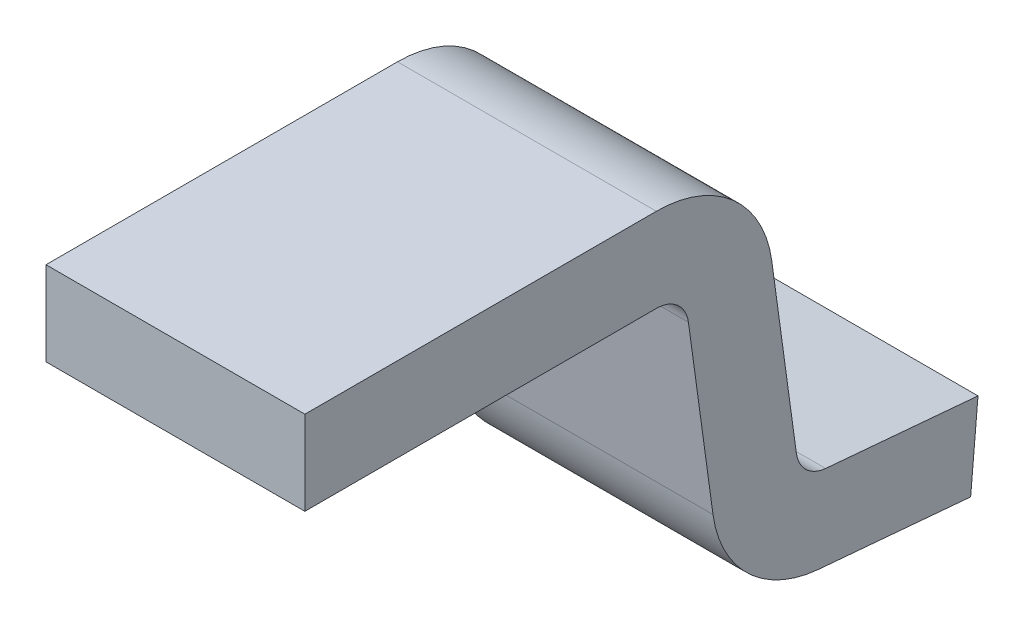
ISO-10303-21;
HEADER;
FILE_DESCRIPTION(('STEP AP214'),'2;1');
FILE_NAME('part.step','',(''),(''),'','','');
FILE_SCHEMA(('AUTOMOTIVE_DESIGN { 1 0 10303 214 1 1 1 1 }'));
ENDSEC;
DATA;
#1=APPLICATION_CONTEXT('core data for automotive mechanical design processes');
#2=APPLICATION_PROTOCOL_DEFINITION('international standard','automotive_design',2000,#1);
#3=PRODUCT_CONTEXT('',#1,'mechanical');
#4=PRODUCT('Part','Part','',(#3));
#5=PRODUCT_RELATED_PRODUCT_CATEGORY('part','',(#4));
#6=PRODUCT_DEFINITION_FORMATION('','',#4);
#7=PRODUCT_DEFINITION_CONTEXT('part definition',#1,'design');
#8=PRODUCT_DEFINITION('design','',#6,#7);
#9=PRODUCT_DEFINITION_SHAPE('','',#8);
#10=(LENGTH_UNIT() NAMED_UNIT(*) SI_UNIT(.MILLI.,.METRE.));
#11=(NAMED_UNIT(*) PLANE_ANGLE_UNIT() SI_UNIT($,.RADIAN.));
#12=(NAMED_UNIT(*) SI_UNIT($,.STERADIAN.) SOLID_ANGLE_UNIT());
#13=UNCERTAINTY_MEASURE_WITH_UNIT(LENGTH_MEASURE(1.E-05),#10,'distance_accuracy_value','');
#14=(GEOMETRIC_REPRESENTATION_CONTEXT(3) GLOBAL_UNCERTAINTY_ASSIGNED_CONTEXT((#13)) GLOBAL_UNIT_ASSIGNED_CONTEXT((#10,
#11,#12)) REPRESENTATION_CONTEXT('',''));
#15=CARTESIAN_POINT('',(0.,0.,0.));
#16=DIRECTION('',(0.,0.,1.));
#17=DIRECTION('',(1.,0.,0.));
#18=AXIS2_PLACEMENT_3D('',#15,#16,#17);
#19=CARTESIAN_POINT('',(-4.626,3.4206,-4.3760443022156));
#20=DIRECTION('',(-1.,0.,0.));
#21=DIRECTION('',(0.,0.,1.));
#22=AXIS2_PLACEMENT_3D('',#19,#20,#21);
#23=CYLINDRICAL_SURFACE('',#22,0.18);
#24=CARTESIAN_POINT('',(-5.026,3.4206,-4.3760443022156));
#25=DIRECTION('',(1.,0.,0.));
#26=DIRECTION('',(0.,0.,-1.));
#27=AXIS2_PLACEMENT_3D('',#24,#25,#26);
#28=CIRCLE('',#27,0.18);
#29=CARTESIAN_POINT('',(-5.026,3.4451056785533,-4.5543683659834));
#30=VERTEX_POINT('',#29);
#31=CARTESIAN_POINT('',(-5.026,3.6006,-4.3760443022156));
#32=VERTEX_POINT('',#31);
#33=EDGE_CURVE('E11',#30,#32,#28,.T.);
#34=ORIENTED_EDGE('',*,*,#33,.T.);
#35=DIRECTION('',(-1.,0.,0.));
#36=VECTOR('',#35,1.);
#37=CARTESIAN_POINT('',(-4.626,3.6006,-4.3760443022156));
#38=LINE('',#37,#36);
#39=CARTESIAN_POINT('',(-4.626,3.6006,-4.3760443022156));
#40=VERTEX_POINT('',#39);
#41=EDGE_CURVE('E24',#40,#32,#38,.T.);
#42=ORIENTED_EDGE('',*,*,#41,.F.);
#43=CARTESIAN_POINT('',(-4.626,3.4206,-4.3760443022156));
#44=DIRECTION('',(1.,0.,0.));
#45=DIRECTION('',(0.,0.,-1.));
#46=AXIS2_PLACEMENT_3D('',#43,#44,#45);
#47=CIRCLE('',#46,0.18);
#48=CARTESIAN_POINT('',(-4.626,3.4451056785533,-4.5543683659834));
#49=VERTEX_POINT('',#48);
#50=EDGE_CURVE('E199',#49,#40,#47,.T.);
#51=ORIENTED_EDGE('',*,*,#50,.F.);
#52=DIRECTION('',(-1.,0.,0.));
#53=VECTOR('',#52,1.);
#54=CARTESIAN_POINT('',(-4.626,3.4451056785533,-4.5543683659834));
#55=LINE('',#54,#53);
#56=EDGE_CURVE('E126',#49,#30,#55,.T.);
#57=ORIENTED_EDGE('',*,*,#56,.T.);
#58=EDGE_LOOP('',(#34,#42,#51,#57));
#59=FACE_BOUND('',#58,.T.);
#60=ADVANCED_FACE('F17',(#59),#23,.T.);
#61=CARTESIAN_POINT('',(-4.626,3.6006,-4.3760443022156));
#62=DIRECTION('',(0.,-1.,0.));
#63=DIRECTION('',(0.,0.,-1.));
#64=AXIS2_PLACEMENT_3D('',#61,#62,#63);
#65=PLANE('',#64);
#66=DIRECTION('',(0.,0.,1.));
#67=VECTOR('',#66,1.);
#68=CARTESIAN_POINT('',(-5.026,3.6006,-4.3760443022156));
#69=LINE('',#68,#67);
#70=CARTESIAN_POINT('',(-5.026,3.6006,-3.833));
#71=VERTEX_POINT('',#70);
#72=EDGE_CURVE('E196',#32,#71,#69,.T.);
#73=ORIENTED_EDGE('',*,*,#72,.T.);
#74=DIRECTION('',(-1.,0.,0.));
#75=VECTOR('',#74,1.);
#76=CARTESIAN_POINT('',(-4.626,3.6006,-3.833));
#77=LINE('',#76,#75);
#78=CARTESIAN_POINT('',(-4.626,3.6006,-3.833));
#79=VERTEX_POINT('',#78);
#80=EDGE_CURVE('E193',#79,#71,#77,.T.);
#81=ORIENTED_EDGE('',*,*,#80,.F.);
#82=DIRECTION('',(0.,0.,1.));
#83=VECTOR('',#82,1.);
#84=CARTESIAN_POINT('',(-4.626,3.6006,-4.3760443022156));
#85=LINE('',#84,#83);
#86=EDGE_CURVE('E190',#40,#79,#85,.T.);
#87=ORIENTED_EDGE('',*,*,#86,.F.);
#88=ORIENTED_EDGE('',*,*,#41,.T.);
#89=EDGE_LOOP('',(#73,#81,#87,#88));
#90=FACE_BOUND('',#89,.T.);
#91=ADVANCED_FACE('F202',(#90),#65,.F.);
#92=CARTESIAN_POINT('',(-4.626,3.6006,-3.833));
#93=DIRECTION('',(0.,0.,-1.));
#94=DIRECTION('',(0.,1.,0.));
#95=AXIS2_PLACEMENT_3D('',#92,#93,#94);
#96=PLANE('',#95);
#97=DIRECTION('',(0.,-1.,0.));
#98=VECTOR('',#97,1.);
#99=CARTESIAN_POINT('',(-5.026,3.6006,-3.833));
#100=LINE('',#99,#98);
#101=CARTESIAN_POINT('',(-5.026,3.4706,-3.833));
#102=VERTEX_POINT('',#101);
#103=EDGE_CURVE('E188',#71,#102,#100,.T.);
#104=ORIENTED_EDGE('',*,*,#103,.T.);
#105=DIRECTION('',(-1.,0.,0.));
#106=VECTOR('',#105,1.);
#107=CARTESIAN_POINT('',(-4.626,3.4706,-3.833));
#108=LINE('',#107,#106);
#109=CARTESIAN_POINT('',(-4.626,3.4706,-3.833));
#110=VERTEX_POINT('',#109);
#111=EDGE_CURVE('E185',#110,#102,#108,.T.);
#112=ORIENTED_EDGE('',*,*,#111,.F.);
#113=DIRECTION('',(0.,-1.,0.));
#114=VECTOR('',#113,1.);
#115=CARTESIAN_POINT('',(-4.626,3.6006,-3.833));
#116=LINE('',#115,#114);
#117=EDGE_CURVE('E182',#79,#110,#116,.T.);
#118=ORIENTED_EDGE('',*,*,#117,.F.);
#119=ORIENTED_EDGE('',*,*,#80,.T.);
#120=EDGE_LOOP('',(#104,#112,#118,#119));
#121=FACE_BOUND('',#120,.T.);
#122=ADVANCED_FACE('F208',(#121),#96,.F.);
#123=CARTESIAN_POINT('',(-4.626,3.4706,-3.833));
#124=DIRECTION('',(0.,1.,0.));
#125=DIRECTION('',(0.,0.,1.));
#126=AXIS2_PLACEMENT_3D('',#123,#124,#125);
#127=PLANE('',#126);
#128=DIRECTION('',(0.,0.,-1.));
#129=VECTOR('',#128,1.);
#130=CARTESIAN_POINT('',(-5.026,3.4706,-3.833));
#131=LINE('',#130,#129);
#132=CARTESIAN_POINT('',(-5.026,3.4706,-4.3760443022156));
#133=VERTEX_POINT('',#132);
#134=EDGE_CURVE('E180',#102,#133,#131,.T.);
#135=ORIENTED_EDGE('',*,*,#134,.T.);
#136=DIRECTION('',(-1.,0.,0.));
#137=VECTOR('',#136,1.);
#138=CARTESIAN_POINT('',(-4.626,3.4706,-4.3760443022156));
#139=LINE('',#138,#137);
#140=CARTESIAN_POINT('',(-4.626,3.4706,-4.3760443022156));
#141=VERTEX_POINT('',#140);
#142=EDGE_CURVE('E177',#141,#133,#139,.T.);
#143=ORIENTED_EDGE('',*,*,#142,.F.);
#144=DIRECTION('',(0.,0.,-1.));
#145=VECTOR('',#144,1.);
#146=CARTESIAN_POINT('',(-4.626,3.4706,-3.833));
#147=LINE('',#146,#145);
#148=EDGE_CURVE('E174',#110,#141,#147,.T.);
#149=ORIENTED_EDGE('',*,*,#148,.F.);
#150=ORIENTED_EDGE('',*,*,#111,.T.);
#151=EDGE_LOOP('',(#135,#143,#149,#150));
#152=FACE_BOUND('',#151,.T.);
#153=ADVANCED_FACE('F212',(#152),#127,.F.);
#154=CARTESIAN_POINT('',(-4.626,3.4206,-4.3760443022156));
#155=DIRECTION('',(-1.,0.,0.));
#156=DIRECTION('',(0.,0.,1.));
#157=AXIS2_PLACEMENT_3D('',#154,#155,#156);
#158=CYLINDRICAL_SURFACE('',#157,0.0499999999999997);
#159=CARTESIAN_POINT('',(-5.026,3.4206,-4.3760443022156));
#160=DIRECTION('',(-1.,0.,0.));
#161=DIRECTION('',(0.,0.,1.));
#162=AXIS2_PLACEMENT_3D('',#159,#160,#161);
#163=CIRCLE('',#162,0.0499999999999997);
#164=CARTESIAN_POINT('',(-5.026,3.4274071329314,-4.4255787643733));
#165=VERTEX_POINT('',#164);
#166=EDGE_CURVE('E171',#133,#165,#163,.T.);
#167=ORIENTED_EDGE('',*,*,#166,.T.);
#168=DIRECTION('',(-1.,0.,0.));
#169=VECTOR('',#168,1.);
#170=CARTESIAN_POINT('',(-4.626,3.4274071329314,-4.4255787643733));
#171=LINE('',#170,#169);
#172=CARTESIAN_POINT('',(-4.626,3.4274071329314,-4.4255787643733));
#173=VERTEX_POINT('',#172);
#174=EDGE_CURVE('E169',#173,#165,#171,.T.);
#175=ORIENTED_EDGE('',*,*,#174,.F.);
#176=CARTESIAN_POINT('',(-4.626,3.4206,-4.3760443022156));
#177=DIRECTION('',(-1.,0.,0.));
#178=DIRECTION('',(0.,0.,1.));
#179=AXIS2_PLACEMENT_3D('',#176,#177,#178);
#180=CIRCLE('',#179,0.0499999999999997);
#181=EDGE_CURVE('E167',#141,#173,#180,.T.);
#182=ORIENTED_EDGE('',*,*,#181,.F.);
#183=ORIENTED_EDGE('',*,*,#142,.T.);
#184=EDGE_LOOP('',(#167,#175,#182,#183));
#185=FACE_BOUND('',#184,.T.);
#186=ADVANCED_FACE('F216',(#185),#158,.F.);
#187=CARTESIAN_POINT('',(-4.626,3.4274071329314,-4.4255787643733));
#188=DIRECTION('',(0.,0.136142658629304,-0.990689243154151));
#189=DIRECTION('',(0.,0.990689243154151,0.136142658629304));
#190=AXIS2_PLACEMENT_3D('',#187,#188,#189);
#191=PLANE('',#190);
#192=DIRECTION('',(0.,-0.990689243154151,-0.136142658629304));
#193=VECTOR('',#192,1.);
#194=CARTESIAN_POINT('',(-5.026,3.4274071329314,-4.4255787643733));
#195=LINE('',#194,#193);
#196=CARTESIAN_POINT('',(-5.026,3.151010491973,-4.4635617886126));
#197=VERTEX_POINT('',#196);
#198=EDGE_CURVE('E165',#165,#197,#195,.T.);
#199=ORIENTED_EDGE('',*,*,#198,.T.);
#200=DIRECTION('',(-1.,0.,0.));
#201=VECTOR('',#200,1.);
#202=CARTESIAN_POINT('',(-4.626,3.151010491973,-4.4635617886126));
#203=LINE('',#202,#201);
#204=CARTESIAN_POINT('',(-4.626,3.151010491973,-4.4635617886126));
#205=VERTEX_POINT('',#204);
#206=EDGE_CURVE('E162',#205,#197,#203,.T.);
#207=ORIENTED_EDGE('',*,*,#206,.F.);
#208=DIRECTION('',(0.,-0.990689243154151,-0.136142658629304));
#209=VECTOR('',#208,1.);
#210=CARTESIAN_POINT('',(-4.626,3.4274071329314,-4.4255787643733));
#211=LINE('',#210,#209);
#212=EDGE_CURVE('E159',#173,#205,#211,.T.);
#213=ORIENTED_EDGE('',*,*,#212,.F.);
#214=ORIENTED_EDGE('',*,*,#174,.T.);
#215=EDGE_LOOP('',(#199,#207,#213,#214));
#216=FACE_BOUND('',#215,.T.);
#217=ADVANCED_FACE('F220',(#216),#191,.F.);
#218=CARTESIAN_POINT('',(-4.626,3.1755161705263,-4.6418858523803));
#219=DIRECTION('',(-1.,0.,0.));
#220=DIRECTION('',(0.,0.,1.));
#221=AXIS2_PLACEMENT_3D('',#218,#219,#220);
#222=CYLINDRICAL_SURFACE('',#221,0.18);
#223=CARTESIAN_POINT('',(-5.026,3.1755161705263,-4.6418858523803));
#224=DIRECTION('',(1.,0.,0.));
#225=DIRECTION('',(0.,0.,1.));
#226=AXIS2_PLACEMENT_3D('',#223,#224,#225);
#227=CIRCLE('',#226,0.18);
#228=CARTESIAN_POINT('',(-5.026,2.9962011248698,-4.6261978186858));
#229=VERTEX_POINT('',#228);
#230=EDGE_CURVE('E157',#197,#229,#227,.T.);
#231=ORIENTED_EDGE('',*,*,#230,.T.);
#232=DIRECTION('',(-1.,0.,0.));
#233=VECTOR('',#232,1.);
#234=CARTESIAN_POINT('',(-4.626,2.9962011248698,-4.6261978186858));
#235=LINE('',#234,#233);
#236=CARTESIAN_POINT('',(-4.626,2.9962011248698,-4.6261978186858));
#237=VERTEX_POINT('',#236);
#238=EDGE_CURVE('E154',#237,#229,#235,.T.);
#239=ORIENTED_EDGE('',*,*,#238,.F.);
#240=CARTESIAN_POINT('',(-4.626,3.1755161705263,-4.6418858523803));
#241=DIRECTION('',(1.,0.,0.));
#242=DIRECTION('',(0.,0.,1.));
#243=AXIS2_PLACEMENT_3D('',#240,#241,#242);
#244=CIRCLE('',#243,0.18);
#245=EDGE_CURVE('E151',#205,#237,#244,.T.);
#246=ORIENTED_EDGE('',*,*,#245,.F.);
#247=ORIENTED_EDGE('',*,*,#206,.T.);
#248=EDGE_LOOP('',(#231,#239,#246,#247));
#249=FACE_BOUND('',#248,.T.);
#250=ADVANCED_FACE('F224',(#249),#222,.T.);
#251=CARTESIAN_POINT('',(-4.626,2.9756,-4.8616697534428));
#252=DIRECTION('',(0.,0.996194698091746,-0.087155742747652));
#253=DIRECTION('',(0.,0.087155742747652,0.996194698091746));
#254=AXIS2_PLACEMENT_3D('',#251,#252,#253);
#255=PLANE('',#254);
#256=DIRECTION('',(0.,-0.087155742747652,-0.996194698091746));
#257=VECTOR('',#256,1.);
#258=CARTESIAN_POINT('',(-5.026,2.9756,-4.8616697534428));
#259=LINE('',#258,#257);
#260=CARTESIAN_POINT('',(-5.026,2.9756,-4.8616697534428));
#261=VERTEX_POINT('',#260);
#262=EDGE_CURVE('E149',#229,#261,#259,.T.);
#263=ORIENTED_EDGE('',*,*,#262,.T.);
#264=DIRECTION('',(-1.,0.,0.));
#265=VECTOR('',#264,1.);
#266=CARTESIAN_POINT('',(-4.626,2.9756,-4.8616697534428));
#267=LINE('',#266,#265);
#268=CARTESIAN_POINT('',(-4.626,2.9756,-4.8616697534428));
#269=VERTEX_POINT('',#268);
#270=EDGE_CURVE('E146',#269,#261,#267,.T.);
#271=ORIENTED_EDGE('',*,*,#270,.F.);
#272=DIRECTION('',(0.,-0.087155742747652,-0.996194698091746));
#273=VECTOR('',#272,1.);
#274=CARTESIAN_POINT('',(-4.626,2.9756,-4.8616697534428));
#275=LINE('',#274,#273);
#276=EDGE_CURVE('E143',#237,#269,#275,.T.);
#277=ORIENTED_EDGE('',*,*,#276,.F.);
#278=ORIENTED_EDGE('',*,*,#238,.T.);
#279=EDGE_LOOP('',(#263,#271,#277,#278));
#280=FACE_BOUND('',#279,.T.);
#281=ADVANCED_FACE('F228',(#280),#255,.F.);
#282=CARTESIAN_POINT('',(-4.626,2.9756,-4.8616697534428));
#283=DIRECTION('',(0.,0.0871557427476519,0.996194698091746));
#284=DIRECTION('',(0.,-0.996194698091746,0.0871557427476519));
#285=AXIS2_PLACEMENT_3D('',#282,#283,#284);
#286=PLANE('',#285);
#287=DIRECTION('',(0.,0.996194698091746,-0.0871557427476519));
#288=VECTOR('',#287,1.);
#289=CARTESIAN_POINT('',(-5.026,2.9756,-4.8616697534428));
#290=LINE('',#289,#288);
#291=CARTESIAN_POINT('',(-5.026,3.1051053107519,-4.873));
#292=VERTEX_POINT('',#291);
#293=EDGE_CURVE('E141',#261,#292,#290,.T.);
#294=ORIENTED_EDGE('',*,*,#293,.T.);
#295=DIRECTION('',(-1.,0.,0.));
#296=VECTOR('',#295,1.);
#297=CARTESIAN_POINT('',(-4.626,3.1051053107519,-4.873));
#298=LINE('',#297,#296);
#299=CARTESIAN_POINT('',(-4.626,3.1051053107519,-4.873));
#300=VERTEX_POINT('',#299);
#301=EDGE_CURVE('E138',#300,#292,#298,.T.);
#302=ORIENTED_EDGE('',*,*,#301,.F.);
#303=DIRECTION('',(0.,0.996194698091746,-0.0871557427476519));
#304=VECTOR('',#303,1.);
#305=CARTESIAN_POINT('',(-4.626,2.9756,-4.8616697534428));
#306=LINE('',#305,#304);
#307=EDGE_CURVE('E136',#269,#300,#306,.T.);
#308=ORIENTED_EDGE('',*,*,#307,.F.);
#309=ORIENTED_EDGE('',*,*,#270,.T.);
#310=EDGE_LOOP('',(#294,#302,#308,#309));
#311=FACE_BOUND('',#310,.T.);
#312=ADVANCED_FACE('F232',(#311),#286,.F.);
#313=CARTESIAN_POINT('',(-4.626,3.1051053107519,-4.873));
#314=DIRECTION('',(0.,-0.996194698091746,0.0871557427476516));
#315=DIRECTION('',(0.,-0.0871557427476516,-0.996194698091746));
#316=AXIS2_PLACEMENT_3D('',#313,#314,#315);
#317=PLANE('',#316);
#318=DIRECTION('',(0.,0.0871557427476516,0.996194698091746));
#319=VECTOR('',#318,1.);
#320=CARTESIAN_POINT('',(-5.026,3.1051053107519,-4.873));
#321=LINE('',#320,#319);
#322=CARTESIAN_POINT('',(-5.026,3.1257064356217,-4.637528065243));
#323=VERTEX_POINT('',#322);
#324=EDGE_CURVE('E134',#292,#323,#321,.T.);
#325=ORIENTED_EDGE('',*,*,#324,.T.);
#326=DIRECTION('',(-1.,0.,0.));
#327=VECTOR('',#326,1.);
#328=CARTESIAN_POINT('',(-4.626,3.1257064356217,-4.637528065243));
#329=LINE('',#328,#327);
#330=CARTESIAN_POINT('',(-4.626,3.1257064356217,-4.637528065243));
#331=VERTEX_POINT('',#330);
#332=EDGE_CURVE('E132',#331,#323,#329,.T.);
#333=ORIENTED_EDGE('',*,*,#332,.F.);
#334=DIRECTION('',(0.,0.0871557427476516,0.996194698091746));
#335=VECTOR('',#334,1.);
#336=CARTESIAN_POINT('',(-4.626,3.1051053107519,-4.873));
#337=LINE('',#336,#335);
#338=EDGE_CURVE('E111',#300,#331,#337,.T.);
#339=ORIENTED_EDGE('',*,*,#338,.F.);
#340=ORIENTED_EDGE('',*,*,#301,.T.);
#341=EDGE_LOOP('',(#325,#333,#339,#340));
#342=FACE_BOUND('',#341,.T.);
#343=ADVANCED_FACE('F235',(#342),#317,.F.);
#344=CARTESIAN_POINT('',(-4.626,3.1755161705263,-4.6418858523803));
#345=DIRECTION('',(-1.,0.,0.));
#346=DIRECTION('',(0.,0.,1.));
#347=AXIS2_PLACEMENT_3D('',#344,#345,#346);
#348=CYLINDRICAL_SURFACE('',#347,0.0499999999999997);
#349=CARTESIAN_POINT('',(-5.026,3.1755161705263,-4.6418858523803));
#350=DIRECTION('',(-1.,0.,0.));
#351=DIRECTION('',(0.,0.,1.));
#352=AXIS2_PLACEMENT_3D('',#349,#350,#351);
#353=CIRCLE('',#352,0.0499999999999997);
#354=CARTESIAN_POINT('',(-5.026,3.1687090375948,-4.5923513902226));
#355=VERTEX_POINT('',#354);
#356=EDGE_CURVE('E120',#323,#355,#353,.T.);
#357=ORIENTED_EDGE('',*,*,#356,.T.);
#358=DIRECTION('',(-1.,0.,0.));
#359=VECTOR('',#358,1.);
#360=CARTESIAN_POINT('',(-4.626,3.1687090375948,-4.5923513902226));
#361=LINE('',#360,#359);
#362=CARTESIAN_POINT('',(-4.626,3.1687090375948,-4.5923513902226));
#363=VERTEX_POINT('',#362);
#364=EDGE_CURVE('E114',#363,#355,#361,.T.);
#365=ORIENTED_EDGE('',*,*,#364,.F.);
#366=CARTESIAN_POINT('',(-4.626,3.1755161705263,-4.6418858523803));
#367=DIRECTION('',(-1.,0.,0.));
#368=DIRECTION('',(0.,0.,1.));
#369=AXIS2_PLACEMENT_3D('',#366,#367,#368);
#370=CIRCLE('',#369,0.0499999999999997);
#371=EDGE_CURVE('E103',#331,#363,#370,.T.);
#372=ORIENTED_EDGE('',*,*,#371,.F.);
#373=ORIENTED_EDGE('',*,*,#332,.T.);
#374=EDGE_LOOP('',(#357,#365,#372,#373));
#375=FACE_BOUND('',#374,.T.);
#376=ADVANCED_FACE('F118',(#375),#348,.F.);
#377=CARTESIAN_POINT('',(-4.626,3.1687090375948,-4.5923513902226));
#378=DIRECTION('',(0.,-0.136142658629305,0.990689243154151));
#379=DIRECTION('',(0.,-0.990689243154151,-0.136142658629305));
#380=AXIS2_PLACEMENT_3D('',#377,#378,#379);
#381=PLANE('',#380);
#382=DIRECTION('',(0.,0.990689243154151,0.136142658629305));
#383=VECTOR('',#382,1.);
#384=CARTESIAN_POINT('',(-5.026,3.1687090375948,-4.5923513902226));
#385=LINE('',#384,#383);
#386=EDGE_CURVE('E115',#355,#30,#385,.T.);
#387=ORIENTED_EDGE('',*,*,#386,.T.);
#388=ORIENTED_EDGE('',*,*,#56,.F.);
#389=DIRECTION('',(0.,0.990689243154151,0.136142658629305));
#390=VECTOR('',#389,1.);
#391=CARTESIAN_POINT('',(-4.626,3.1687090375948,-4.5923513902226));
#392=LINE('',#391,#390);
#393=EDGE_CURVE('E108',#363,#49,#392,.T.);
#394=ORIENTED_EDGE('',*,*,#393,.F.);
#395=ORIENTED_EDGE('',*,*,#364,.T.);
#396=EDGE_LOOP('',(#387,#388,#394,#395));
#397=FACE_BOUND('',#396,.T.);
#398=ADVANCED_FACE('F125',(#397),#381,.F.);
#399=CARTESIAN_POINT('',(-4.626,3.4206,-4.3760443022156));
#400=DIRECTION('',(1.,0.,0.));
#401=DIRECTION('',(0.,0.,-1.));
#402=AXIS2_PLACEMENT_3D('',#399,#400,#401);
#403=PLANE('',#402);
#404=ORIENTED_EDGE('',*,*,#50,.T.);
#405=ORIENTED_EDGE('',*,*,#86,.T.);
#406=ORIENTED_EDGE('',*,*,#117,.T.);
#407=ORIENTED_EDGE('',*,*,#148,.T.);
#408=ORIENTED_EDGE('',*,*,#181,.T.);
#409=ORIENTED_EDGE('',*,*,#212,.T.);
#410=ORIENTED_EDGE('',*,*,#245,.T.);
#411=ORIENTED_EDGE('',*,*,#276,.T.);
#412=ORIENTED_EDGE('',*,*,#307,.T.);
#413=ORIENTED_EDGE('',*,*,#338,.T.);
#414=ORIENTED_EDGE('',*,*,#371,.T.);
#415=ORIENTED_EDGE('',*,*,#393,.T.);
#416=EDGE_LOOP('',(#404,#405,#406,#407,#408,#409,#410,#411,#412,#413,#414,#415));
#417=FACE_BOUND('',#416,.T.);
#418=ADVANCED_FACE('F106',(#417),#403,.T.);
#419=CARTESIAN_POINT('',(-5.026,3.4206,-4.3760443022156));
#420=DIRECTION('',(1.,0.,0.));
#421=DIRECTION('',(0.,0.,-1.));
#422=AXIS2_PLACEMENT_3D('',#419,#420,#421);
#423=PLANE('',#422);
#424=ORIENTED_EDGE('',*,*,#33,.F.);
#425=ORIENTED_EDGE('',*,*,#386,.F.);
#426=ORIENTED_EDGE('',*,*,#356,.F.);
#427=ORIENTED_EDGE('',*,*,#324,.F.);
#428=ORIENTED_EDGE('',*,*,#293,.F.);
#429=ORIENTED_EDGE('',*,*,#262,.F.);
#430=ORIENTED_EDGE('',*,*,#230,.F.);
#431=ORIENTED_EDGE('',*,*,#198,.F.);
#432=ORIENTED_EDGE('',*,*,#166,.F.);
#433=ORIENTED_EDGE('',*,*,#134,.F.);
#434=ORIENTED_EDGE('',*,*,#103,.F.);
#435=ORIENTED_EDGE('',*,*,#72,.F.);
#436=EDGE_LOOP('',(#424,#425,#426,#427,#428,#429,#430,#431,#432,#433,#434,#435));
#437=FACE_BOUND('',#436,.T.);
#438=ADVANCED_FACE('F204',(#437),#423,.F.);
#439=CLOSED_SHELL('',(#60,#91,#122,#153,#186,#217,#250,#281,#312,#343,#376,#398,#418,#438));
#440=MANIFOLD_SOLID_BREP('B1',#439);
#441=ADVANCED_BREP_SHAPE_REPRESENTATION('',(#18,#440),#14);
#442=SHAPE_DEFINITION_REPRESENTATION(#9,#441);
ENDSEC;
END-ISO-10303-21;
